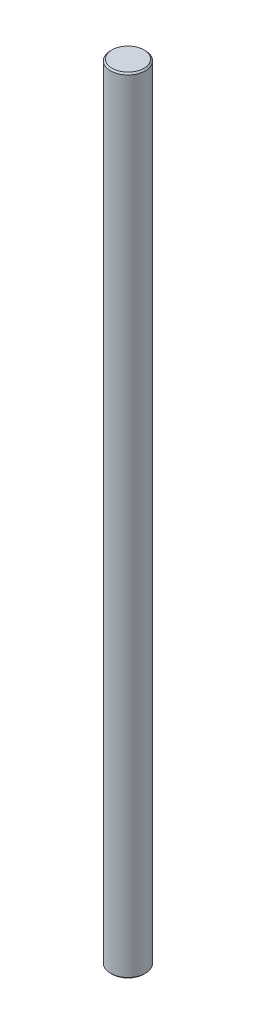
ISO-10303-21;
HEADER;
FILE_DESCRIPTION(('STEP AP214'),'2;1');
FILE_NAME('part.step','',(''),(''),'','','');
FILE_SCHEMA(('AUTOMOTIVE_DESIGN { 1 0 10303 214 1 1 1 1 }'));
ENDSEC;
DATA;
#1=APPLICATION_CONTEXT('core data for automotive mechanical design processes');
#2=APPLICATION_PROTOCOL_DEFINITION('international standard','automotive_design',2000,#1);
#3=PRODUCT_CONTEXT('',#1,'mechanical');
#4=PRODUCT('Part','Part','',(#3));
#5=PRODUCT_RELATED_PRODUCT_CATEGORY('part','',(#4));
#6=PRODUCT_DEFINITION_FORMATION('','',#4);
#7=PRODUCT_DEFINITION_CONTEXT('part definition',#1,'design');
#8=PRODUCT_DEFINITION('design','',#6,#7);
#9=PRODUCT_DEFINITION_SHAPE('','',#8);
#10=(LENGTH_UNIT() NAMED_UNIT(*) SI_UNIT(.MILLI.,.METRE.));
#11=(NAMED_UNIT(*) PLANE_ANGLE_UNIT() SI_UNIT($,.RADIAN.));
#12=(NAMED_UNIT(*) SI_UNIT($,.STERADIAN.) SOLID_ANGLE_UNIT());
#13=UNCERTAINTY_MEASURE_WITH_UNIT(LENGTH_MEASURE(1.E-05),#10,'distance_accuracy_value','');
#14=(GEOMETRIC_REPRESENTATION_CONTEXT(3) GLOBAL_UNCERTAINTY_ASSIGNED_CONTEXT((#13)) GLOBAL_UNIT_ASSIGNED_CONTEXT((#10,
#11,#12)) REPRESENTATION_CONTEXT('',''));
#15=CARTESIAN_POINT('',(0.,0.,0.));
#16=DIRECTION('',(0.,0.,1.));
#17=DIRECTION('',(1.,0.,0.));
#18=AXIS2_PLACEMENT_3D('',#15,#16,#17);
#19=CARTESIAN_POINT('',(0.,270.,0.));
#20=DIRECTION('',(0.,-1.,0.));
#21=DIRECTION('',(0.,0.,-1.));
#22=AXIS2_PLACEMENT_3D('',#19,#20,#21);
#23=CYLINDRICAL_SURFACE('',#22,6.);
#24=CARTESIAN_POINT('',(0.,269.5,0.));
#25=DIRECTION('',(0.,1.,0.));
#26=DIRECTION('',(0.,0.,1.));
#27=AXIS2_PLACEMENT_3D('',#24,#25,#26);
#28=CIRCLE('',#27,6.);
#29=CARTESIAN_POINT('',(0.,269.5,6.));
#30=VERTEX_POINT('',#29);
#31=EDGE_CURVE('E49',#30,#30,#28,.F.);
#32=ORIENTED_EDGE('',*,*,#31,.T.);
#33=EDGE_LOOP('',(#32));
#34=FACE_BOUND('',#33,.T.);
#35=CARTESIAN_POINT('',(0.,0.5,0.));
#36=DIRECTION('',(0.,1.,0.));
#37=DIRECTION('',(0.,0.,1.));
#38=AXIS2_PLACEMENT_3D('',#35,#36,#37);
#39=CIRCLE('',#38,6.);
#40=CARTESIAN_POINT('',(0.,0.5,6.));
#41=VERTEX_POINT('',#40);
#42=EDGE_CURVE('E53',#41,#41,#39,.T.);
#43=ORIENTED_EDGE('',*,*,#42,.T.);
#44=EDGE_LOOP('',(#43));
#45=FACE_BOUND('',#44,.T.);
#46=ADVANCED_FACE('F42',(#34,#45),#23,.T.);
#47=CARTESIAN_POINT('',(0.,270.,0.));
#48=DIRECTION('',(0.,1.,0.));
#49=DIRECTION('',(0.,0.,1.));
#50=AXIS2_PLACEMENT_3D('',#47,#48,#49);
#51=PLANE('',#50);
#52=CARTESIAN_POINT('',(0.,270.,0.));
#53=DIRECTION('',(0.,1.,0.));
#54=DIRECTION('',(0.,0.,1.));
#55=AXIS2_PLACEMENT_3D('',#52,#53,#54);
#56=CIRCLE('',#55,5.49999999999995);
#57=CARTESIAN_POINT('',(0.,270.,5.49999999999995));
#58=VERTEX_POINT('',#57);
#59=EDGE_CURVE('E57',#58,#58,#56,.T.);
#60=ORIENTED_EDGE('',*,*,#59,.T.);
#61=EDGE_LOOP('',(#60));
#62=FACE_BOUND('',#61,.T.);
#63=ADVANCED_FACE('F63',(#62),#51,.T.);
#64=CARTESIAN_POINT('',(0.,0.,0.));
#65=DIRECTION('',(0.,1.,0.));
#66=DIRECTION('',(0.,0.,1.));
#67=AXIS2_PLACEMENT_3D('',#64,#65,#66);
#68=PLANE('',#67);
#69=CARTESIAN_POINT('',(0.,0.,0.));
#70=DIRECTION('',(0.,1.,0.));
#71=DIRECTION('',(0.,0.,1.));
#72=AXIS2_PLACEMENT_3D('',#69,#70,#71);
#73=CIRCLE('',#72,5.50000000000001);
#74=CARTESIAN_POINT('',(0.,0.,5.50000000000001));
#75=VERTEX_POINT('',#74);
#76=EDGE_CURVE('E12',#75,#75,#73,.F.);
#77=ORIENTED_EDGE('',*,*,#76,.T.);
#78=EDGE_LOOP('',(#77));
#79=FACE_BOUND('',#78,.T.);
#80=ADVANCED_FACE('F67',(#79),#68,.F.);
#81=CARTESIAN_POINT('',(0.,270.,0.));
#82=DIRECTION('',(0.,-1.,0.));
#83=DIRECTION('',(0.,0.,-1.));
#84=AXIS2_PLACEMENT_3D('',#81,#82,#83);
#85=CONICAL_SURFACE('',#84,5.49999999999995,0.785398163397444);
#86=ORIENTED_EDGE('',*,*,#31,.F.);
#87=EDGE_LOOP('',(#86));
#88=FACE_BOUND('',#87,.T.);
#89=ORIENTED_EDGE('',*,*,#59,.F.);
#90=EDGE_LOOP('',(#89));
#91=FACE_BOUND('',#90,.T.);
#92=ADVANCED_FACE('F65',(#88,#91),#85,.T.);
#93=CARTESIAN_POINT('',(0.,0.5,0.));
#94=DIRECTION('',(0.,1.,0.));
#95=DIRECTION('',(0.,0.,1.));
#96=AXIS2_PLACEMENT_3D('',#93,#94,#95);
#97=CONICAL_SURFACE('',#96,6.,0.785398163397443);
#98=ORIENTED_EDGE('',*,*,#76,.F.);
#99=EDGE_LOOP('',(#98));
#100=FACE_BOUND('',#99,.T.);
#101=ORIENTED_EDGE('',*,*,#42,.F.);
#102=EDGE_LOOP('',(#101));
#103=FACE_BOUND('',#102,.T.);
#104=ADVANCED_FACE('F44',(#100,#103),#97,.T.);
#105=CLOSED_SHELL('',(#46,#63,#80,#92,#104));
#106=MANIFOLD_SOLID_BREP('B2',#105);
#107=ADVANCED_BREP_SHAPE_REPRESENTATION('',(#18,#106),#14);
#108=SHAPE_DEFINITION_REPRESENTATION(#9,#107);
ENDSEC;
END-ISO-10303-21;
